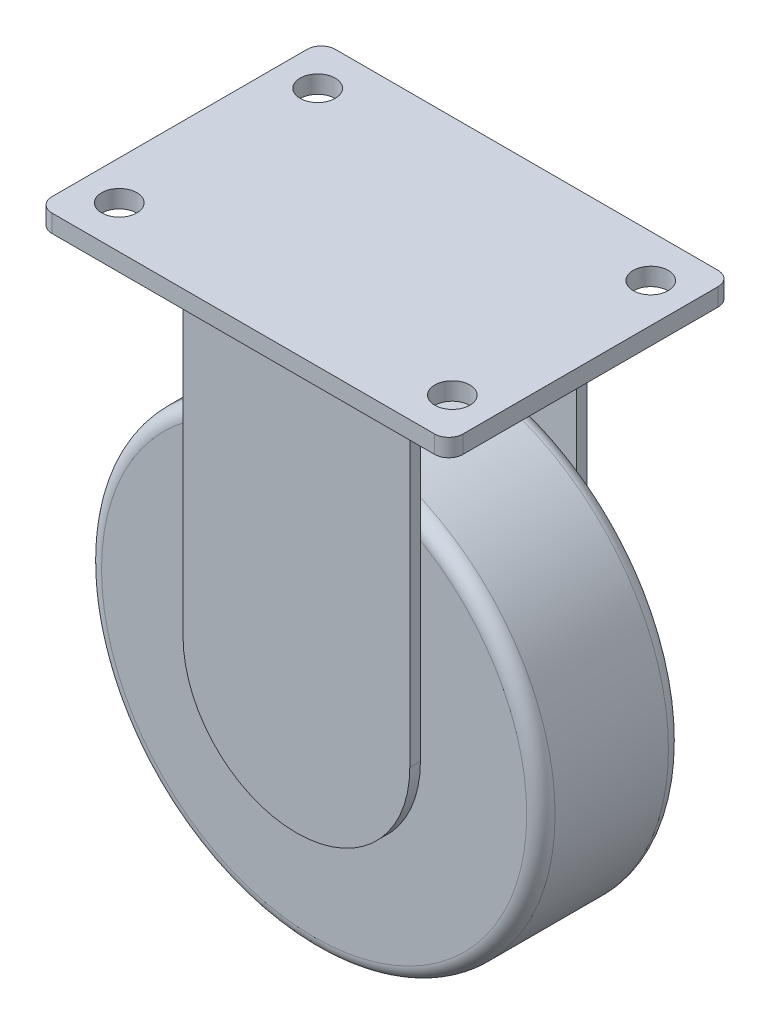
ISO-10303-21;
HEADER;
FILE_DESCRIPTION(('STEP AP214'),'2;1');
FILE_NAME('part.step','',(''),(''),'','','');
FILE_SCHEMA(('AUTOMOTIVE_DESIGN { 1 0 10303 214 1 1 1 1 }'));
ENDSEC;
DATA;
#1=APPLICATION_CONTEXT('core data for automotive mechanical design processes');
#2=APPLICATION_PROTOCOL_DEFINITION('international standard','automotive_design',2000,#1);
#3=PRODUCT_CONTEXT('',#1,'mechanical');
#4=PRODUCT('Part','Part','',(#3));
#5=PRODUCT_RELATED_PRODUCT_CATEGORY('part','',(#4));
#6=PRODUCT_DEFINITION_FORMATION('','',#4);
#7=PRODUCT_DEFINITION_CONTEXT('part definition',#1,'design');
#8=PRODUCT_DEFINITION('design','',#6,#7);
#9=PRODUCT_DEFINITION_SHAPE('','',#8);
#10=(LENGTH_UNIT() NAMED_UNIT(*) SI_UNIT(.MILLI.,.METRE.));
#11=(NAMED_UNIT(*) PLANE_ANGLE_UNIT() SI_UNIT($,.RADIAN.));
#12=(NAMED_UNIT(*) SI_UNIT($,.STERADIAN.) SOLID_ANGLE_UNIT());
#13=UNCERTAINTY_MEASURE_WITH_UNIT(LENGTH_MEASURE(1.E-05),#10,'distance_accuracy_value','');
#14=(GEOMETRIC_REPRESENTATION_CONTEXT(3) GLOBAL_UNCERTAINTY_ASSIGNED_CONTEXT((#13)) GLOBAL_UNIT_ASSIGNED_CONTEXT((#10,
#11,#12)) REPRESENTATION_CONTEXT('',''));
#15=CARTESIAN_POINT('',(0.,0.,0.));
#16=DIRECTION('',(0.,0.,1.));
#17=DIRECTION('',(1.,0.,0.));
#18=AXIS2_PLACEMENT_3D('',#15,#16,#17);
#19=CARTESIAN_POINT('',(0.,-75.40625,-500000.));
#20=DIRECTION('',(0.,0.,1.));
#21=DIRECTION('',(1.,0.,0.));
#22=AXIS2_PLACEMENT_3D('',#19,#20,#21);
#23=CYLINDRICAL_SURFACE('',#22,6.35);
#24=CARTESIAN_POINT('',(0.,-75.40625,-17.4625000000219));
#25=DIRECTION('',(0.,0.,1.));
#26=DIRECTION('',(1.,0.,0.));
#27=AXIS2_PLACEMENT_3D('',#24,#25,#26);
#28=CIRCLE('',#27,6.35);
#29=CARTESIAN_POINT('',(6.35,-75.40625,-17.4625000000788));
#30=VERTEX_POINT('',#29);
#31=EDGE_CURVE('E303',#30,#30,#28,.T.);
#32=CARTESIAN_POINT('',(0.,-75.40625,-15.8749999999941));
#33=DIRECTION('',(0.,0.,1.));
#34=DIRECTION('',(1.,0.,0.));
#35=AXIS2_PLACEMENT_3D('',#32,#33,#34);
#36=CIRCLE('',#35,6.35);
#37=CARTESIAN_POINT('',(6.35,-75.40625,-15.8750000000509));
#38=VERTEX_POINT('',#37);
#39=EDGE_CURVE('E310',#38,#38,#36,.F.);
#40=CARTESIAN_POINT('',(6.35,-75.40625,-17.4625000000788));
#41=CARTESIAN_POINT('',(6.35,-75.40625,-17.4459635417368));
#42=CARTESIAN_POINT('',(6.35,-75.40625,-17.4294270833949));
#43=CARTESIAN_POINT('',(6.35,-75.40625,-17.3963541667301));
#44=CARTESIAN_POINT('',(6.35,-75.40625,-17.3798177084071));
#45=CARTESIAN_POINT('',(6.35,-75.40625,-17.3467447917422));
#46=CARTESIAN_POINT('',(6.35,-75.40625,-17.3302083334003));
#47=CARTESIAN_POINT('',(6.35,-75.40625,-17.2971354167354));
#48=CARTESIAN_POINT('',(6.35,-75.40625,-17.2805989584125));
#49=CARTESIAN_POINT('',(6.35,-75.40625,-17.2475260417476));
#50=CARTESIAN_POINT('',(6.35,-75.40625,-17.2309895834057));
#51=CARTESIAN_POINT('',(6.35,-75.40625,-17.1979166667408));
#52=CARTESIAN_POINT('',(6.35,-75.40625,-17.1813802084178));
#53=CARTESIAN_POINT('',(6.35,-75.40625,-17.1483072917529));
#54=CARTESIAN_POINT('',(6.35,-75.40625,-17.131770833411));
#55=CARTESIAN_POINT('',(6.35,-75.40625,-17.0986979167462));
#56=CARTESIAN_POINT('',(6.35,-75.40625,-17.0821614584232));
#57=CARTESIAN_POINT('',(6.35,-75.40625,-17.0490885417583));
#58=CARTESIAN_POINT('',(6.35,-75.40625,-17.0325520834164));
#59=CARTESIAN_POINT('',(6.35,-75.40625,-16.9994791667326));
#60=CARTESIAN_POINT('',(6.35,-75.40625,-16.9829427083907));
#61=CARTESIAN_POINT('',(6.35,-75.40625,-16.9498697917258));
#62=CARTESIAN_POINT('',(6.35,-75.40625,-16.9333333334028));
#63=CARTESIAN_POINT('',(6.35,-75.40625,-16.9002604167379));
#64=CARTESIAN_POINT('',(6.35,-75.40625,-16.883723958396));
#65=CARTESIAN_POINT('',(6.35,-75.40625,-16.8506510417312));
#66=CARTESIAN_POINT('',(6.35,-75.40625,-16.8341145834082));
#67=CARTESIAN_POINT('',(6.35,-75.40625,-16.8010416667433));
#68=CARTESIAN_POINT('',(6.35,-75.40625,-16.7845052084014));
#69=CARTESIAN_POINT('',(6.35,-75.40625,-16.7514322917365));
#70=CARTESIAN_POINT('',(6.35,-75.40625,-16.7348958334135));
#71=CARTESIAN_POINT('',(6.35,-75.40625,-16.7018229167487));
#72=CARTESIAN_POINT('',(6.35,-75.40625,-16.6852864584068));
#73=CARTESIAN_POINT('',(6.35,-75.40625,-16.6522135417229));
#74=CARTESIAN_POINT('',(6.35,-75.40625,-16.635677083381));
#75=CARTESIAN_POINT('',(6.35,-75.40625,-16.6026041667161));
#76=CARTESIAN_POINT('',(6.35,-75.40625,-16.5860677083932));
#77=CARTESIAN_POINT('',(6.35,-75.40625,-16.5529947917283));
#78=CARTESIAN_POINT('',(6.35,-75.40625,-16.5364583333864));
#79=CARTESIAN_POINT('',(6.35,-75.40625,-16.5033854167215));
#80=CARTESIAN_POINT('',(6.35,-75.40625,-16.4868489583985));
#81=CARTESIAN_POINT('',(6.35,-75.40625,-16.4537760417337));
#82=CARTESIAN_POINT('',(6.35,-75.40625,-16.4372395833918));
#83=CARTESIAN_POINT('',(6.35,-75.40625,-16.4041666667269));
#84=CARTESIAN_POINT('',(6.35,-75.40625,-16.3876302084039));
#85=CARTESIAN_POINT('',(6.35,-75.40625,-16.354557291739));
#86=CARTESIAN_POINT('',(6.35,-75.40625,-16.3380208333971));
#87=CARTESIAN_POINT('',(6.35,-75.40625,-16.3049479167133));
#88=CARTESIAN_POINT('',(6.35,-75.40625,-16.2884114583714));
#89=CARTESIAN_POINT('',(6.35,-75.40625,-16.2553385417065));
#90=CARTESIAN_POINT('',(6.35,-75.40625,-16.2388020833835));
#91=CARTESIAN_POINT('',(6.35,-75.40625,-16.2057291667187));
#92=CARTESIAN_POINT('',(6.35,-75.40625,-16.1891927083767));
#93=CARTESIAN_POINT('',(6.35,-75.40625,-16.1561197917119));
#94=CARTESIAN_POINT('',(6.35,-75.40625,-16.1395833333889));
#95=CARTESIAN_POINT('',(6.35,-75.40625,-16.106510416724));
#96=CARTESIAN_POINT('',(6.35,-75.40625,-16.0899739583821));
#97=CARTESIAN_POINT('',(6.35,-75.40625,-16.0569010417172));
#98=CARTESIAN_POINT('',(6.35,-75.40625,-16.0403645833943));
#99=CARTESIAN_POINT('',(6.35,-75.40625,-16.0072916667294));
#100=CARTESIAN_POINT('',(6.35,-75.40625,-15.9907552083875));
#101=CARTESIAN_POINT('',(6.35,-75.40625,-15.9576822917226));
#102=CARTESIAN_POINT('',(6.35,-75.40625,-15.9411458333996));
#103=CARTESIAN_POINT('',(6.35,-75.40625,-15.9080729167348));
#104=CARTESIAN_POINT('',(6.35,-75.40625,-15.8915364583928));
#105=CARTESIAN_POINT('',(6.35,-75.40625,-15.8750000000509));
#106=B_SPLINE_CURVE_WITH_KNOTS('',3,(#40,#41,#42,#43,#44,#45,#46,#47,#48,#49,#50,#51,#52,#53,
#54,#55,#56,#57,#58,#59,#60,#61,#62,#63,#64,#65,#66,#67,#68,#69,#70,#71,#72,#73,#74,#75,#76,#77,
#78,#79,#80,#81,#82,#83,#84,#85,#86,#87,#88,#89,#90,#91,#92,#93,#94,#95,#96,#97,#98,#99,#100,
#101,#102,#103,#104,#105),.UNSPECIFIED.,.F.,.F.,(4,2,2,2,2,2,2,2,2,2,2,2,2,2,2,2,2,2,2,2,2,2,2,
2,2,2,2,2,2,2,2,2,4),(0.,0.0496093750257387,0.099218749994634,0.148828125020373,
0.198437499989268,0.248046875015007,0.297656249983902,0.347265625009641,0.396874999978536,
0.446484375004275,0.496093750030013,0.545703124998909,0.595312500024647,0.644921874993543,
0.694531250019281,0.744140624988177,0.793750000013915,0.843359375039654,0.892968750008549,
0.942578125034288,0.992187500003183,1.04179687502892,1.09140624999782,1.14101562502356,
1.19062500004929,1.24023437501819,1.28984375004393,1.33945312501282,1.38906250003856,
1.43867187500746,1.4882812500332,1.53789062500209,1.58750000002783),.UNSPECIFIED.);
#107=EDGE_CURVE('BSEAM48',#30,#38,#106,.T.);
#108=ORIENTED_EDGE('',*,*,#31,.T.);
#109=ORIENTED_EDGE('',*,*,#39,.T.);
#110=ORIENTED_EDGE('',*,*,#107,.T.);
#111=ORIENTED_EDGE('',*,*,#107,.F.);
#112=EDGE_LOOP('',(#108,#110,#109,#111));
#113=FACE_BOUND('',#112,.T.);
#114=ADVANCED_FACE('F48',(#113),#23,.T.);
#115=CARTESIAN_POINT('',(-46.0375,3.96875,31.75));
#116=DIRECTION('',(0.,1.,0.));
#117=DIRECTION('',(0.,0.,1.));
#118=AXIS2_PLACEMENT_3D('',#115,#116,#117);
#119=PLANE('',#118);
#120=CARTESIAN_POINT('',(37.30625,3.96875,22.225));
#121=DIRECTION('',(0.,1.,0.));
#122=DIRECTION('',(0.,0.,1.));
#123=AXIS2_PLACEMENT_3D('',#120,#121,#122);
#124=CIRCLE('',#123,3.937);
#125=CARTESIAN_POINT('',(37.30625,3.96875,26.162));
#126=VERTEX_POINT('',#125);
#127=EDGE_CURVE('E243',#126,#126,#124,.T.);
#128=ORIENTED_EDGE('',*,*,#127,.F.);
#129=EDGE_LOOP('',(#128));
#130=FACE_BOUND('',#129,.T.);
#131=CARTESIAN_POINT('',(-37.30625,3.96875,-22.225));
#132=DIRECTION('',(0.,1.,0.));
#133=DIRECTION('',(0.,0.,1.));
#134=AXIS2_PLACEMENT_3D('',#131,#132,#133);
#135=CIRCLE('',#134,3.937);
#136=CARTESIAN_POINT('',(-37.30625,3.96875,-18.288));
#137=VERTEX_POINT('',#136);
#138=EDGE_CURVE('E255',#137,#137,#135,.T.);
#139=ORIENTED_EDGE('',*,*,#138,.F.);
#140=EDGE_LOOP('',(#139));
#141=FACE_BOUND('',#140,.T.);
#142=DIRECTION('',(-1.,0.,0.));
#143=VECTOR('',#142,1.);
#144=CARTESIAN_POINT('',(-46.0375,3.96875,-31.75));
#145=LINE('',#144,#143);
#146=CARTESIAN_POINT('',(42.8625,3.96875,-31.75));
#147=VERTEX_POINT('',#146);
#148=CARTESIAN_POINT('',(-42.8625,3.96875,-31.75));
#149=VERTEX_POINT('',#148);
#150=EDGE_CURVE('E276',#147,#149,#145,.T.);
#151=ORIENTED_EDGE('',*,*,#150,.T.);
#152=CARTESIAN_POINT('',(-42.8625,3.96875,-28.575));
#153=DIRECTION('',(0.,1.,0.));
#154=DIRECTION('',(0.,0.,1.));
#155=AXIS2_PLACEMENT_3D('',#152,#153,#154);
#156=CIRCLE('',#155,3.175);
#157=CARTESIAN_POINT('',(-46.0375,3.96875,-28.575));
#158=VERTEX_POINT('',#157);
#159=EDGE_CURVE('E350',#149,#158,#156,.T.);
#160=ORIENTED_EDGE('',*,*,#159,.T.);
#161=DIRECTION('',(0.,0.,1.));
#162=VECTOR('',#161,1.);
#163=CARTESIAN_POINT('',(-46.0375,3.96875,-31.75));
#164=LINE('',#163,#162);
#165=CARTESIAN_POINT('',(-46.0375,3.96875,28.575));
#166=VERTEX_POINT('',#165);
#167=EDGE_CURVE('E269',#158,#166,#164,.T.);
#168=ORIENTED_EDGE('',*,*,#167,.T.);
#169=CARTESIAN_POINT('',(-42.8625,3.96875,28.575));
#170=DIRECTION('',(0.,1.,0.));
#171=DIRECTION('',(0.,0.,1.));
#172=AXIS2_PLACEMENT_3D('',#169,#170,#171);
#173=CIRCLE('',#172,3.175);
#174=CARTESIAN_POINT('',(-42.8625,3.96875,31.75));
#175=VERTEX_POINT('',#174);
#176=EDGE_CURVE('E345',#166,#175,#173,.T.);
#177=ORIENTED_EDGE('',*,*,#176,.T.);
#178=DIRECTION('',(1.,0.,0.));
#179=VECTOR('',#178,1.);
#180=CARTESIAN_POINT('',(-46.0375,3.96875,31.75));
#181=LINE('',#180,#179);
#182=CARTESIAN_POINT('',(42.8625,3.96875,31.75));
#183=VERTEX_POINT('',#182);
#184=EDGE_CURVE('E272',#175,#183,#181,.T.);
#185=ORIENTED_EDGE('',*,*,#184,.T.);
#186=CARTESIAN_POINT('',(42.8625,3.96875,28.575));
#187=DIRECTION('',(0.,1.,0.));
#188=DIRECTION('',(0.,0.,1.));
#189=AXIS2_PLACEMENT_3D('',#186,#187,#188);
#190=CIRCLE('',#189,3.175);
#191=CARTESIAN_POINT('',(46.0375,3.96875,28.575));
#192=VERTEX_POINT('',#191);
#193=EDGE_CURVE('E70',#183,#192,#190,.T.);
#194=ORIENTED_EDGE('',*,*,#193,.T.);
#195=DIRECTION('',(0.,0.,-1.));
#196=VECTOR('',#195,1.);
#197=CARTESIAN_POINT('',(46.0375,3.96875,-31.75));
#198=LINE('',#197,#196);
#199=CARTESIAN_POINT('',(46.0375,3.96875,-28.575));
#200=VERTEX_POINT('',#199);
#201=EDGE_CURVE('E274',#192,#200,#198,.T.);
#202=ORIENTED_EDGE('',*,*,#201,.T.);
#203=CARTESIAN_POINT('',(42.8625,3.96875,-28.575));
#204=DIRECTION('',(0.,1.,0.));
#205=DIRECTION('',(0.,0.,1.));
#206=AXIS2_PLACEMENT_3D('',#203,#204,#205);
#207=CIRCLE('',#206,3.175);
#208=EDGE_CURVE('E348',#200,#147,#207,.T.);
#209=ORIENTED_EDGE('',*,*,#208,.T.);
#210=EDGE_LOOP('',(#151,#160,#168,#177,#185,#194,#202,#209));
#211=FACE_BOUND('',#210,.T.);
#212=CARTESIAN_POINT('',(-37.30625,3.96875,22.225));
#213=DIRECTION('',(0.,1.,0.));
#214=DIRECTION('',(0.,0.,1.));
#215=AXIS2_PLACEMENT_3D('',#212,#213,#214);
#216=CIRCLE('',#215,3.937);
#217=CARTESIAN_POINT('',(-37.30625,3.96875,26.162));
#218=VERTEX_POINT('',#217);
#219=EDGE_CURVE('E249',#218,#218,#216,.T.);
#220=ORIENTED_EDGE('',*,*,#219,.F.);
#221=EDGE_LOOP('',(#220));
#222=FACE_BOUND('',#221,.T.);
#223=CARTESIAN_POINT('',(37.30625,3.96875,-22.225));
#224=DIRECTION('',(0.,1.,0.));
#225=DIRECTION('',(0.,0.,1.));
#226=AXIS2_PLACEMENT_3D('',#223,#224,#225);
#227=CIRCLE('',#226,3.937);
#228=CARTESIAN_POINT('',(37.30625,3.96875,-18.288));
#229=VERTEX_POINT('',#228);
#230=EDGE_CURVE('E237',#229,#229,#227,.T.);
#231=ORIENTED_EDGE('',*,*,#230,.F.);
#232=EDGE_LOOP('',(#231));
#233=FACE_BOUND('',#232,.T.);
#234=ADVANCED_FACE('F373',(#130,#141,#211,#222,#233),#119,.T.);
#235=CARTESIAN_POINT('',(-46.0375,0.,31.75));
#236=DIRECTION('',(0.,1.,0.));
#237=DIRECTION('',(0.,0.,1.));
#238=AXIS2_PLACEMENT_3D('',#235,#236,#237);
#239=PLANE('',#238);
#240=DIRECTION('',(-1.,0.,0.));
#241=VECTOR('',#240,1.);
#242=CARTESIAN_POINT('',(-25.4,0.,-19.84375));
#243=LINE('',#242,#241);
#244=CARTESIAN_POINT('',(25.4,0.,-19.84375));
#245=VERTEX_POINT('',#244);
#246=CARTESIAN_POINT('',(-25.4,0.,-19.84375));
#247=VERTEX_POINT('',#246);
#248=EDGE_CURVE('E186',#245,#247,#243,.T.);
#249=ORIENTED_EDGE('',*,*,#248,.T.);
#250=DIRECTION('',(0.,0.,1.));
#251=VECTOR('',#250,1.);
#252=CARTESIAN_POINT('',(-25.4,0.,-17.4625));
#253=LINE('',#252,#251);
#254=CARTESIAN_POINT('',(-25.4,0.,-17.4625));
#255=VERTEX_POINT('',#254);
#256=EDGE_CURVE('E180',#247,#255,#253,.T.);
#257=ORIENTED_EDGE('',*,*,#256,.T.);
#258=DIRECTION('',(1.,0.,0.));
#259=VECTOR('',#258,1.);
#260=CARTESIAN_POINT('',(-25.4,0.,-17.4625));
#261=LINE('',#260,#259);
#262=CARTESIAN_POINT('',(25.4,0.,-17.4625));
#263=VERTEX_POINT('',#262);
#264=EDGE_CURVE('E189',#255,#263,#261,.T.);
#265=ORIENTED_EDGE('',*,*,#264,.T.);
#266=DIRECTION('',(0.,0.,-1.));
#267=VECTOR('',#266,1.);
#268=CARTESIAN_POINT('',(25.4,0.,-17.4625));
#269=LINE('',#268,#267);
#270=EDGE_CURVE('E195',#263,#245,#269,.T.);
#271=ORIENTED_EDGE('',*,*,#270,.T.);
#272=EDGE_LOOP('',(#249,#257,#265,#271));
#273=FACE_BOUND('',#272,.T.);
#274=DIRECTION('',(-1.,0.,0.));
#275=VECTOR('',#274,1.);
#276=CARTESIAN_POINT('',(-25.4,0.,17.4625));
#277=LINE('',#276,#275);
#278=CARTESIAN_POINT('',(25.4,0.,17.4625));
#279=VERTEX_POINT('',#278);
#280=CARTESIAN_POINT('',(-25.4,0.,17.4625));
#281=VERTEX_POINT('',#280);
#282=EDGE_CURVE('E223',#279,#281,#277,.T.);
#283=ORIENTED_EDGE('',*,*,#282,.T.);
#284=DIRECTION('',(0.,0.,1.));
#285=VECTOR('',#284,1.);
#286=CARTESIAN_POINT('',(-25.4,0.,19.84375));
#287=LINE('',#286,#285);
#288=CARTESIAN_POINT('',(-25.4,0.,19.84375));
#289=VERTEX_POINT('',#288);
#290=EDGE_CURVE('E211',#281,#289,#287,.T.);
#291=ORIENTED_EDGE('',*,*,#290,.T.);
#292=DIRECTION('',(1.,0.,0.));
#293=VECTOR('',#292,1.);
#294=CARTESIAN_POINT('',(-25.4,0.,19.84375));
#295=LINE('',#294,#293);
#296=CARTESIAN_POINT('',(25.4,0.,19.84375));
#297=VERTEX_POINT('',#296);
#298=EDGE_CURVE('E217',#289,#297,#295,.T.);
#299=ORIENTED_EDGE('',*,*,#298,.T.);
#300=DIRECTION('',(0.,0.,-1.));
#301=VECTOR('',#300,1.);
#302=CARTESIAN_POINT('',(25.4,0.,19.84375));
#303=LINE('',#302,#301);
#304=EDGE_CURVE('E220',#297,#279,#303,.T.);
#305=ORIENTED_EDGE('',*,*,#304,.T.);
#306=EDGE_LOOP('',(#283,#291,#299,#305));
#307=FACE_BOUND('',#306,.T.);
#308=CARTESIAN_POINT('',(37.30625,0.,22.225));
#309=DIRECTION('',(0.,1.,0.));
#310=DIRECTION('',(0.,0.,1.));
#311=AXIS2_PLACEMENT_3D('',#308,#309,#310);
#312=CIRCLE('',#311,3.937);
#313=CARTESIAN_POINT('',(37.30625,0.,26.162));
#314=VERTEX_POINT('',#313);
#315=EDGE_CURVE('E240',#314,#314,#312,.T.);
#316=ORIENTED_EDGE('',*,*,#315,.T.);
#317=EDGE_LOOP('',(#316));
#318=FACE_BOUND('',#317,.T.);
#319=CARTESIAN_POINT('',(-37.30625,0.,-22.225));
#320=DIRECTION('',(0.,1.,0.));
#321=DIRECTION('',(0.,0.,1.));
#322=AXIS2_PLACEMENT_3D('',#319,#320,#321);
#323=CIRCLE('',#322,3.937);
#324=CARTESIAN_POINT('',(-37.30625,0.,-18.288));
#325=VERTEX_POINT('',#324);
#326=EDGE_CURVE('E252',#325,#325,#323,.T.);
#327=ORIENTED_EDGE('',*,*,#326,.T.);
#328=EDGE_LOOP('',(#327));
#329=FACE_BOUND('',#328,.T.);
#330=DIRECTION('',(0.,0.,1.));
#331=VECTOR('',#330,1.);
#332=CARTESIAN_POINT('',(-46.0375,0.,-31.75));
#333=LINE('',#332,#331);
#334=CARTESIAN_POINT('',(-46.0375,0.,-28.575));
#335=VERTEX_POINT('',#334);
#336=CARTESIAN_POINT('',(-46.0375,0.,28.575));
#337=VERTEX_POINT('',#336);
#338=EDGE_CURVE('E258',#335,#337,#333,.T.);
#339=ORIENTED_EDGE('',*,*,#338,.F.);
#340=CARTESIAN_POINT('',(-42.8625,0.,-28.575));
#341=DIRECTION('',(0.,1.,0.));
#342=DIRECTION('',(0.,0.,1.));
#343=AXIS2_PLACEMENT_3D('',#340,#341,#342);
#344=CIRCLE('',#343,3.175);
#345=CARTESIAN_POINT('',(-42.8625,0.,-31.75));
#346=VERTEX_POINT('',#345);
#347=EDGE_CURVE('E338',#335,#346,#344,.F.);
#348=ORIENTED_EDGE('',*,*,#347,.T.);
#349=DIRECTION('',(-1.,0.,0.));
#350=VECTOR('',#349,1.);
#351=CARTESIAN_POINT('',(-46.0375,0.,-31.75));
#352=LINE('',#351,#350);
#353=CARTESIAN_POINT('',(42.8625,0.,-31.75));
#354=VERTEX_POINT('',#353);
#355=EDGE_CURVE('E266',#354,#346,#352,.T.);
#356=ORIENTED_EDGE('',*,*,#355,.F.);
#357=CARTESIAN_POINT('',(42.8625,0.,-28.575));
#358=DIRECTION('',(0.,1.,0.));
#359=DIRECTION('',(0.,0.,1.));
#360=AXIS2_PLACEMENT_3D('',#357,#358,#359);
#361=CIRCLE('',#360,3.175);
#362=CARTESIAN_POINT('',(46.0375,0.,-28.575));
#363=VERTEX_POINT('',#362);
#364=EDGE_CURVE('E336',#354,#363,#361,.F.);
#365=ORIENTED_EDGE('',*,*,#364,.T.);
#366=DIRECTION('',(0.,0.,-1.));
#367=VECTOR('',#366,1.);
#368=CARTESIAN_POINT('',(46.0375,0.,-31.75));
#369=LINE('',#368,#367);
#370=CARTESIAN_POINT('',(46.0375,0.,28.575));
#371=VERTEX_POINT('',#370);
#372=EDGE_CURVE('E264',#371,#363,#369,.T.);
#373=ORIENTED_EDGE('',*,*,#372,.F.);
#374=CARTESIAN_POINT('',(42.8625,0.,28.575));
#375=DIRECTION('',(0.,1.,0.));
#376=DIRECTION('',(0.,0.,1.));
#377=AXIS2_PLACEMENT_3D('',#374,#375,#376);
#378=CIRCLE('',#377,3.175);
#379=CARTESIAN_POINT('',(42.8625,0.,31.75));
#380=VERTEX_POINT('',#379);
#381=EDGE_CURVE('E334',#371,#380,#378,.F.);
#382=ORIENTED_EDGE('',*,*,#381,.T.);
#383=DIRECTION('',(1.,0.,0.));
#384=VECTOR('',#383,1.);
#385=CARTESIAN_POINT('',(-46.0375,0.,31.75));
#386=LINE('',#385,#384);
#387=CARTESIAN_POINT('',(-42.8625,0.,31.75));
#388=VERTEX_POINT('',#387);
#389=EDGE_CURVE('E261',#388,#380,#386,.T.);
#390=ORIENTED_EDGE('',*,*,#389,.F.);
#391=CARTESIAN_POINT('',(-42.8625,0.,28.575));
#392=DIRECTION('',(0.,1.,0.));
#393=DIRECTION('',(0.,0.,1.));
#394=AXIS2_PLACEMENT_3D('',#391,#392,#393);
#395=CIRCLE('',#394,3.175);
#396=EDGE_CURVE('E332',#388,#337,#395,.F.);
#397=ORIENTED_EDGE('',*,*,#396,.T.);
#398=EDGE_LOOP('',(#339,#348,#356,#365,#373,#382,#390,#397));
#399=FACE_BOUND('',#398,.T.);
#400=CARTESIAN_POINT('',(-37.30625,0.,22.225));
#401=DIRECTION('',(0.,1.,0.));
#402=DIRECTION('',(0.,0.,1.));
#403=AXIS2_PLACEMENT_3D('',#400,#401,#402);
#404=CIRCLE('',#403,3.937);
#405=CARTESIAN_POINT('',(-37.30625,0.,26.162));
#406=VERTEX_POINT('',#405);
#407=EDGE_CURVE('E246',#406,#406,#404,.T.);
#408=ORIENTED_EDGE('',*,*,#407,.T.);
#409=EDGE_LOOP('',(#408));
#410=FACE_BOUND('',#409,.T.);
#411=CARTESIAN_POINT('',(37.30625,0.,-22.225));
#412=DIRECTION('',(0.,1.,0.));
#413=DIRECTION('',(0.,0.,1.));
#414=AXIS2_PLACEMENT_3D('',#411,#412,#413);
#415=CIRCLE('',#414,3.937);
#416=CARTESIAN_POINT('',(37.30625,0.,-18.288));
#417=VERTEX_POINT('',#416);
#418=EDGE_CURVE('E229',#417,#417,#415,.T.);
#419=ORIENTED_EDGE('',*,*,#418,.T.);
#420=EDGE_LOOP('',(#419));
#421=FACE_BOUND('',#420,.T.);
#422=ADVANCED_FACE('F197',(#273,#307,#318,#329,#399,#410,#421),#239,.F.);
#423=CARTESIAN_POINT('',(-46.0375,3.96875,-31.75));
#424=DIRECTION('',(1.,0.,0.));
#425=DIRECTION('',(0.,0.,-1.));
#426=AXIS2_PLACEMENT_3D('',#423,#424,#425);
#427=PLANE('',#426);
#428=ORIENTED_EDGE('',*,*,#167,.F.);
#429=DIRECTION('',(0.,-1.,0.));
#430=VECTOR('',#429,1.);
#431=CARTESIAN_POINT('',(-46.0375,3.96875,-28.575));
#432=LINE('',#431,#430);
#433=EDGE_CURVE('E329',#158,#335,#432,.T.);
#434=ORIENTED_EDGE('',*,*,#433,.T.);
#435=ORIENTED_EDGE('',*,*,#338,.T.);
#436=DIRECTION('',(0.,-1.,0.));
#437=VECTOR('',#436,1.);
#438=CARTESIAN_POINT('',(-46.0375,3.96875,28.575));
#439=LINE('',#438,#437);
#440=EDGE_CURVE('E327',#337,#166,#439,.F.);
#441=ORIENTED_EDGE('',*,*,#440,.T.);
#442=EDGE_LOOP('',(#428,#434,#435,#441));
#443=FACE_BOUND('',#442,.T.);
#444=ADVANCED_FACE('F50',(#443),#427,.F.);
#445=CARTESIAN_POINT('',(-46.0375,3.96875,31.75));
#446=DIRECTION('',(0.,0.,-1.));
#447=DIRECTION('',(-1.,0.,0.));
#448=AXIS2_PLACEMENT_3D('',#445,#446,#447);
#449=PLANE('',#448);
#450=ORIENTED_EDGE('',*,*,#389,.T.);
#451=DIRECTION('',(0.,-1.,0.));
#452=VECTOR('',#451,1.);
#453=CARTESIAN_POINT('',(42.8625,3.96875,31.75));
#454=LINE('',#453,#452);
#455=EDGE_CURVE('E13',#380,#183,#454,.F.);
#456=ORIENTED_EDGE('',*,*,#455,.T.);
#457=ORIENTED_EDGE('',*,*,#184,.F.);
#458=DIRECTION('',(0.,-1.,0.));
#459=VECTOR('',#458,1.);
#460=CARTESIAN_POINT('',(-42.8625,3.96875,31.75));
#461=LINE('',#460,#459);
#462=EDGE_CURVE('E56',#175,#388,#461,.T.);
#463=ORIENTED_EDGE('',*,*,#462,.T.);
#464=EDGE_LOOP('',(#450,#456,#457,#463));
#465=FACE_BOUND('',#464,.T.);
#466=ADVANCED_FACE('F360',(#465),#449,.F.);
#467=CARTESIAN_POINT('',(46.0375,3.96875,-31.75));
#468=DIRECTION('',(-1.,0.,0.));
#469=DIRECTION('',(0.,0.,1.));
#470=AXIS2_PLACEMENT_3D('',#467,#468,#469);
#471=PLANE('',#470);
#472=ORIENTED_EDGE('',*,*,#372,.T.);
#473=DIRECTION('',(0.,-1.,0.));
#474=VECTOR('',#473,1.);
#475=CARTESIAN_POINT('',(46.0375,3.96875,-28.575));
#476=LINE('',#475,#474);
#477=EDGE_CURVE('E63',#363,#200,#476,.F.);
#478=ORIENTED_EDGE('',*,*,#477,.T.);
#479=ORIENTED_EDGE('',*,*,#201,.F.);
#480=DIRECTION('',(0.,-1.,0.));
#481=VECTOR('',#480,1.);
#482=CARTESIAN_POINT('',(46.0375,3.96875,28.575));
#483=LINE('',#482,#481);
#484=EDGE_CURVE('E352',#192,#371,#483,.T.);
#485=ORIENTED_EDGE('',*,*,#484,.T.);
#486=EDGE_LOOP('',(#472,#478,#479,#485));
#487=FACE_BOUND('',#486,.T.);
#488=ADVANCED_FACE('F371',(#487),#471,.F.);
#489=CARTESIAN_POINT('',(-46.0375,3.96875,-31.75));
#490=DIRECTION('',(0.,0.,1.));
#491=DIRECTION('',(1.,0.,0.));
#492=AXIS2_PLACEMENT_3D('',#489,#490,#491);
#493=PLANE('',#492);
#494=ORIENTED_EDGE('',*,*,#355,.T.);
#495=DIRECTION('',(0.,-1.,0.));
#496=VECTOR('',#495,1.);
#497=CARTESIAN_POINT('',(-42.8625,3.96875,-31.75));
#498=LINE('',#497,#496);
#499=EDGE_CURVE('E343',#346,#149,#498,.F.);
#500=ORIENTED_EDGE('',*,*,#499,.T.);
#501=ORIENTED_EDGE('',*,*,#150,.F.);
#502=DIRECTION('',(0.,-1.,0.));
#503=VECTOR('',#502,1.);
#504=CARTESIAN_POINT('',(42.8625,3.96875,-31.75));
#505=LINE('',#504,#503);
#506=EDGE_CURVE('E340',#147,#354,#505,.T.);
#507=ORIENTED_EDGE('',*,*,#506,.T.);
#508=EDGE_LOOP('',(#494,#500,#501,#507));
#509=FACE_BOUND('',#508,.T.);
#510=ADVANCED_FACE('F381',(#509),#493,.F.);
#511=CARTESIAN_POINT('',(-37.30625,3.96875,-22.225));
#512=DIRECTION('',(0.,-1.,0.));
#513=DIRECTION('',(0.,0.,-1.));
#514=AXIS2_PLACEMENT_3D('',#511,#512,#513);
#515=CYLINDRICAL_SURFACE('',#514,3.937);
#516=ORIENTED_EDGE('',*,*,#138,.T.);
#517=EDGE_LOOP('',(#516));
#518=FACE_BOUND('',#517,.T.);
#519=ORIENTED_EDGE('',*,*,#326,.F.);
#520=EDGE_LOOP('',(#519));
#521=FACE_BOUND('',#520,.T.);
#522=ADVANCED_FACE('F475',(#518,#521),#515,.F.);
#523=CARTESIAN_POINT('',(-37.30625,3.96875,22.225));
#524=DIRECTION('',(0.,-1.,0.));
#525=DIRECTION('',(0.,0.,-1.));
#526=AXIS2_PLACEMENT_3D('',#523,#524,#525);
#527=CYLINDRICAL_SURFACE('',#526,3.937);
#528=ORIENTED_EDGE('',*,*,#219,.T.);
#529=EDGE_LOOP('',(#528));
#530=FACE_BOUND('',#529,.T.);
#531=ORIENTED_EDGE('',*,*,#407,.F.);
#532=EDGE_LOOP('',(#531));
#533=FACE_BOUND('',#532,.T.);
#534=ADVANCED_FACE('F471',(#530,#533),#527,.F.);
#535=CARTESIAN_POINT('',(37.30625,3.96875,22.225));
#536=DIRECTION('',(0.,-1.,0.));
#537=DIRECTION('',(0.,0.,-1.));
#538=AXIS2_PLACEMENT_3D('',#535,#536,#537);
#539=CYLINDRICAL_SURFACE('',#538,3.937);
#540=ORIENTED_EDGE('',*,*,#127,.T.);
#541=EDGE_LOOP('',(#540));
#542=FACE_BOUND('',#541,.T.);
#543=ORIENTED_EDGE('',*,*,#315,.F.);
#544=EDGE_LOOP('',(#543));
#545=FACE_BOUND('',#544,.T.);
#546=ADVANCED_FACE('F467',(#542,#545),#539,.F.);
#547=CARTESIAN_POINT('',(37.30625,3.96875,-22.225));
#548=DIRECTION('',(0.,-1.,0.));
#549=DIRECTION('',(0.,0.,-1.));
#550=AXIS2_PLACEMENT_3D('',#547,#548,#549);
#551=CYLINDRICAL_SURFACE('',#550,3.937);
#552=ORIENTED_EDGE('',*,*,#230,.T.);
#553=EDGE_LOOP('',(#552));
#554=FACE_BOUND('',#553,.T.);
#555=ORIENTED_EDGE('',*,*,#418,.F.);
#556=EDGE_LOOP('',(#555));
#557=FACE_BOUND('',#556,.T.);
#558=ADVANCED_FACE('F464',(#554,#557),#551,.F.);
#559=CARTESIAN_POINT('',(-25.4,-100.80625,19.84375));
#560=DIRECTION('',(-1.,0.,0.));
#561=DIRECTION('',(0.,0.,1.));
#562=AXIS2_PLACEMENT_3D('',#559,#560,#561);
#563=PLANE('',#562);
#564=DIRECTION('',(0.,1.,0.));
#565=VECTOR('',#564,1.);
#566=CARTESIAN_POINT('',(-25.4,-100.80625,17.4625));
#567=LINE('',#566,#565);
#568=CARTESIAN_POINT('',(-25.4,-75.40625,17.4625));
#569=VERTEX_POINT('',#568);
#570=EDGE_CURVE('E227',#569,#281,#567,.T.);
#571=ORIENTED_EDGE('',*,*,#570,.F.);
#572=DIRECTION('',(0.,0.,1.));
#573=VECTOR('',#572,1.);
#574=CARTESIAN_POINT('',(-25.4,-75.40625,19.84375));
#575=LINE('',#574,#573);
#576=CARTESIAN_POINT('',(-25.4,-75.40625,19.84375));
#577=VERTEX_POINT('',#576);
#578=EDGE_CURVE('E279',#569,#577,#575,.T.);
#579=ORIENTED_EDGE('',*,*,#578,.T.);
#580=DIRECTION('',(0.,1.,0.));
#581=VECTOR('',#580,1.);
#582=CARTESIAN_POINT('',(-25.4,-100.80625,19.84375));
#583=LINE('',#582,#581);
#584=EDGE_CURVE('E226',#577,#289,#583,.T.);
#585=ORIENTED_EDGE('',*,*,#584,.T.);
#586=ORIENTED_EDGE('',*,*,#290,.F.);
#587=EDGE_LOOP('',(#571,#579,#585,#586));
#588=FACE_BOUND('',#587,.T.);
#589=ADVANCED_FACE('F429',(#588),#563,.T.);
#590=CARTESIAN_POINT('',(-25.4,-100.80625,17.4625));
#591=DIRECTION('',(0.,0.,-1.));
#592=DIRECTION('',(-1.,0.,0.));
#593=AXIS2_PLACEMENT_3D('',#590,#591,#592);
#594=PLANE('',#593);
#595=CARTESIAN_POINT('',(0.,-75.40625,17.4625000000219));
#596=DIRECTION('',(0.,0.,-1.));
#597=DIRECTION('',(-1.,0.,0.));
#598=AXIS2_PLACEMENT_3D('',#595,#596,#597);
#599=CIRCLE('',#598,6.35);
#600=CARTESIAN_POINT('',(6.35,-75.40625,17.4625000000788));
#601=VERTEX_POINT('',#600);
#602=EDGE_CURVE('E306',#601,#601,#599,.T.);
#603=ORIENTED_EDGE('',*,*,#602,.F.);
#604=EDGE_LOOP('',(#603));
#605=FACE_BOUND('',#604,.T.);
#606=CARTESIAN_POINT('',(0.,-75.40625,17.4625));
#607=DIRECTION('',(0.,0.,-1.));
#608=DIRECTION('',(-1.,0.,0.));
#609=AXIS2_PLACEMENT_3D('',#606,#607,#608);
#610=CIRCLE('',#609,25.4);
#611=CARTESIAN_POINT('',(25.4,-75.40625,17.4625));
#612=VERTEX_POINT('',#611);
#613=CARTESIAN_POINT('',(0.,-100.80625,17.4625));
#614=VERTEX_POINT('',#613);
#615=EDGE_CURVE('E286',#612,#614,#610,.T.);
#616=ORIENTED_EDGE('',*,*,#615,.T.);
#617=CARTESIAN_POINT('',(0.,-75.40625,17.4625));
#618=DIRECTION('',(0.,0.,-1.));
#619=DIRECTION('',(-1.,0.,0.));
#620=AXIS2_PLACEMENT_3D('',#617,#618,#619);
#621=CIRCLE('',#620,25.4);
#622=EDGE_CURVE('E288',#614,#569,#621,.T.);
#623=ORIENTED_EDGE('',*,*,#622,.T.);
#624=ORIENTED_EDGE('',*,*,#570,.T.);
#625=ORIENTED_EDGE('',*,*,#282,.F.);
#626=DIRECTION('',(0.,1.,0.));
#627=VECTOR('',#626,1.);
#628=CARTESIAN_POINT('',(25.4,-100.80625,17.4625));
#629=LINE('',#628,#627);
#630=EDGE_CURVE('E230',#612,#279,#629,.T.);
#631=ORIENTED_EDGE('',*,*,#630,.F.);
#632=EDGE_LOOP('',(#616,#623,#624,#625,#631));
#633=FACE_BOUND('',#632,.T.);
#634=ADVANCED_FACE('F425',(#605,#633),#594,.T.);
#635=CARTESIAN_POINT('',(25.4,-100.80625,19.84375));
#636=DIRECTION('',(1.,0.,0.));
#637=DIRECTION('',(0.,0.,-1.));
#638=AXIS2_PLACEMENT_3D('',#635,#636,#637);
#639=PLANE('',#638);
#640=DIRECTION('',(0.,1.,0.));
#641=VECTOR('',#640,1.);
#642=CARTESIAN_POINT('',(25.4,-100.80625,19.84375));
#643=LINE('',#642,#641);
#644=CARTESIAN_POINT('',(25.4,-75.40625,19.84375));
#645=VERTEX_POINT('',#644);
#646=EDGE_CURVE('E232',#645,#297,#643,.T.);
#647=ORIENTED_EDGE('',*,*,#646,.F.);
#648=DIRECTION('',(0.,0.,-1.));
#649=VECTOR('',#648,1.);
#650=CARTESIAN_POINT('',(25.4,-75.40625,19.84375));
#651=LINE('',#650,#649);
#652=EDGE_CURVE('E301',#645,#612,#651,.T.);
#653=ORIENTED_EDGE('',*,*,#652,.T.);
#654=ORIENTED_EDGE('',*,*,#630,.T.);
#655=ORIENTED_EDGE('',*,*,#304,.F.);
#656=EDGE_LOOP('',(#647,#653,#654,#655));
#657=FACE_BOUND('',#656,.T.);
#658=ADVANCED_FACE('F428',(#657),#639,.T.);
#659=CARTESIAN_POINT('',(-25.4,-100.80625,19.84375));
#660=DIRECTION('',(0.,0.,1.));
#661=DIRECTION('',(1.,0.,0.));
#662=AXIS2_PLACEMENT_3D('',#659,#660,#661);
#663=PLANE('',#662);
#664=ORIENTED_EDGE('',*,*,#584,.F.);
#665=CARTESIAN_POINT('',(0.,-75.40625,19.84375));
#666=DIRECTION('',(0.,0.,1.));
#667=DIRECTION('',(1.,0.,0.));
#668=AXIS2_PLACEMENT_3D('',#665,#666,#667);
#669=CIRCLE('',#668,25.4);
#670=CARTESIAN_POINT('',(0.,-100.80625,19.84375));
#671=VERTEX_POINT('',#670);
#672=EDGE_CURVE('E284',#577,#671,#669,.T.);
#673=ORIENTED_EDGE('',*,*,#672,.T.);
#674=CARTESIAN_POINT('',(0.,-75.40625,19.84375));
#675=DIRECTION('',(0.,0.,1.));
#676=DIRECTION('',(1.,0.,0.));
#677=AXIS2_PLACEMENT_3D('',#674,#675,#676);
#678=CIRCLE('',#677,25.4);
#679=EDGE_CURVE('E282',#671,#645,#678,.T.);
#680=ORIENTED_EDGE('',*,*,#679,.T.);
#681=ORIENTED_EDGE('',*,*,#646,.T.);
#682=ORIENTED_EDGE('',*,*,#298,.F.);
#683=EDGE_LOOP('',(#664,#673,#680,#681,#682));
#684=FACE_BOUND('',#683,.T.);
#685=ADVANCED_FACE('F449',(#684),#663,.T.);
#686=CARTESIAN_POINT('',(-25.4,-100.80625,-17.4625));
#687=DIRECTION('',(-1.,0.,0.));
#688=DIRECTION('',(0.,0.,1.));
#689=AXIS2_PLACEMENT_3D('',#686,#687,#688);
#690=PLANE('',#689);
#691=DIRECTION('',(0.,1.,0.));
#692=VECTOR('',#691,1.);
#693=CARTESIAN_POINT('',(-25.4,-100.80625,-19.84375));
#694=LINE('',#693,#692);
#695=CARTESIAN_POINT('',(-25.4,-75.40625,-19.84375));
#696=VERTEX_POINT('',#695);
#697=EDGE_CURVE('E209',#696,#247,#694,.T.);
#698=ORIENTED_EDGE('',*,*,#697,.F.);
#699=DIRECTION('',(0.,0.,1.));
#700=VECTOR('',#699,1.);
#701=CARTESIAN_POINT('',(-25.4,-75.40625,-17.4625));
#702=LINE('',#701,#700);
#703=CARTESIAN_POINT('',(-25.4,-75.40625,-17.4625));
#704=VERTEX_POINT('',#703);
#705=EDGE_CURVE('E183',#696,#704,#702,.T.);
#706=ORIENTED_EDGE('',*,*,#705,.T.);
#707=DIRECTION('',(0.,1.,0.));
#708=VECTOR('',#707,1.);
#709=CARTESIAN_POINT('',(-25.4,-100.80625,-17.4625));
#710=LINE('',#709,#708);
#711=EDGE_CURVE('E175',#704,#255,#710,.T.);
#712=ORIENTED_EDGE('',*,*,#711,.T.);
#713=ORIENTED_EDGE('',*,*,#256,.F.);
#714=EDGE_LOOP('',(#698,#706,#712,#713));
#715=FACE_BOUND('',#714,.T.);
#716=ADVANCED_FACE('F178',(#715),#690,.T.);
#717=CARTESIAN_POINT('',(-25.4,-100.80625,-19.84375));
#718=DIRECTION('',(0.,0.,-1.));
#719=DIRECTION('',(-1.,0.,0.));
#720=AXIS2_PLACEMENT_3D('',#717,#718,#719);
#721=PLANE('',#720);
#722=CARTESIAN_POINT('',(0.,-75.40625,-19.84375));
#723=DIRECTION('',(0.,0.,-1.));
#724=DIRECTION('',(-1.,0.,0.));
#725=AXIS2_PLACEMENT_3D('',#722,#723,#724);
#726=CIRCLE('',#725,25.4);
#727=CARTESIAN_POINT('',(25.4,-75.40625,-19.84375));
#728=VERTEX_POINT('',#727);
#729=CARTESIAN_POINT('',(0.,-100.80625,-19.84375));
#730=VERTEX_POINT('',#729);
#731=EDGE_CURVE('E295',#728,#730,#726,.T.);
#732=ORIENTED_EDGE('',*,*,#731,.T.);
#733=CARTESIAN_POINT('',(0.,-75.40625,-19.84375));
#734=DIRECTION('',(0.,0.,-1.));
#735=DIRECTION('',(-1.,0.,0.));
#736=AXIS2_PLACEMENT_3D('',#733,#734,#735);
#737=CIRCLE('',#736,25.4);
#738=EDGE_CURVE('E297',#730,#696,#737,.T.);
#739=ORIENTED_EDGE('',*,*,#738,.T.);
#740=ORIENTED_EDGE('',*,*,#697,.T.);
#741=ORIENTED_EDGE('',*,*,#248,.F.);
#742=DIRECTION('',(0.,1.,0.));
#743=VECTOR('',#742,1.);
#744=CARTESIAN_POINT('',(25.4,-100.80625,-19.84375));
#745=LINE('',#744,#743);
#746=EDGE_CURVE('E212',#728,#245,#745,.T.);
#747=ORIENTED_EDGE('',*,*,#746,.F.);
#748=EDGE_LOOP('',(#732,#739,#740,#741,#747));
#749=FACE_BOUND('',#748,.T.);
#750=ADVANCED_FACE('F612',(#749),#721,.T.);
#751=CARTESIAN_POINT('',(25.4,-100.80625,-17.4625));
#752=DIRECTION('',(1.,0.,0.));
#753=DIRECTION('',(0.,0.,-1.));
#754=AXIS2_PLACEMENT_3D('',#751,#752,#753);
#755=PLANE('',#754);
#756=DIRECTION('',(0.,1.,0.));
#757=VECTOR('',#756,1.);
#758=CARTESIAN_POINT('',(25.4,-100.80625,-17.4625));
#759=LINE('',#758,#757);
#760=CARTESIAN_POINT('',(25.4,-75.40625,-17.4625));
#761=VERTEX_POINT('',#760);
#762=EDGE_CURVE('E185',#761,#263,#759,.T.);
#763=ORIENTED_EDGE('',*,*,#762,.F.);
#764=DIRECTION('',(0.,0.,-1.));
#765=VECTOR('',#764,1.);
#766=CARTESIAN_POINT('',(25.4,-75.40625,-17.4625));
#767=LINE('',#766,#765);
#768=EDGE_CURVE('E299',#761,#728,#767,.T.);
#769=ORIENTED_EDGE('',*,*,#768,.T.);
#770=ORIENTED_EDGE('',*,*,#746,.T.);
#771=ORIENTED_EDGE('',*,*,#270,.F.);
#772=EDGE_LOOP('',(#763,#769,#770,#771));
#773=FACE_BOUND('',#772,.T.);
#774=ADVANCED_FACE('F564',(#773),#755,.T.);
#775=CARTESIAN_POINT('',(-25.4,-100.80625,-17.4625));
#776=DIRECTION('',(0.,0.,1.));
#777=DIRECTION('',(1.,0.,0.));
#778=AXIS2_PLACEMENT_3D('',#775,#776,#777);
#779=PLANE('',#778);
#780=ORIENTED_EDGE('',*,*,#31,.F.);
#781=EDGE_LOOP('',(#780));
#782=FACE_BOUND('',#781,.T.);
#783=ORIENTED_EDGE('',*,*,#711,.F.);
#784=CARTESIAN_POINT('',(0.,-75.40625,-17.4625));
#785=DIRECTION('',(0.,0.,1.));
#786=DIRECTION('',(1.,0.,0.));
#787=AXIS2_PLACEMENT_3D('',#784,#785,#786);
#788=CIRCLE('',#787,25.4);
#789=CARTESIAN_POINT('',(0.,-100.80625,-17.4625));
#790=VERTEX_POINT('',#789);
#791=EDGE_CURVE('E293',#704,#790,#788,.T.);
#792=ORIENTED_EDGE('',*,*,#791,.T.);
#793=CARTESIAN_POINT('',(0.,-75.40625,-17.4625));
#794=DIRECTION('',(0.,0.,1.));
#795=DIRECTION('',(1.,0.,0.));
#796=AXIS2_PLACEMENT_3D('',#793,#794,#795);
#797=CIRCLE('',#796,25.4);
#798=EDGE_CURVE('E291',#790,#761,#797,.T.);
#799=ORIENTED_EDGE('',*,*,#798,.T.);
#800=ORIENTED_EDGE('',*,*,#762,.T.);
#801=ORIENTED_EDGE('',*,*,#264,.F.);
#802=EDGE_LOOP('',(#783,#792,#799,#800,#801));
#803=FACE_BOUND('',#802,.T.);
#804=ADVANCED_FACE('F190',(#782,#803),#779,.T.);
#805=CARTESIAN_POINT('',(0.,-75.40625,19.8437499999999));
#806=DIRECTION('',(0.,0.,-1.));
#807=DIRECTION('',(-1.,0.,0.));
#808=AXIS2_PLACEMENT_3D('',#805,#806,#807);
#809=CYLINDRICAL_SURFACE('',#808,25.4);
#810=DIRECTION('',(0.,0.,-1.));
#811=VECTOR('',#810,1.);
#812=CARTESIAN_POINT('',(0.,-100.80625,17.4625000000001));
#813=LINE('',#812,#811);
#814=EDGE_CURVE('E200',#614,#671,#813,.F.);
#815=ORIENTED_EDGE('',*,*,#814,.F.);
#816=ORIENTED_EDGE('',*,*,#615,.F.);
#817=ORIENTED_EDGE('',*,*,#652,.F.);
#818=ORIENTED_EDGE('',*,*,#679,.F.);
#819=EDGE_LOOP('',(#815,#816,#817,#818));
#820=FACE_BOUND('',#819,.T.);
#821=ADVANCED_FACE('F440',(#820),#809,.T.);
#822=CARTESIAN_POINT('',(0.,-75.40625,19.84375));
#823=DIRECTION('',(0.,0.,1.));
#824=DIRECTION('',(1.,0.,0.));
#825=AXIS2_PLACEMENT_3D('',#822,#823,#824);
#826=CYLINDRICAL_SURFACE('',#825,25.4);
#827=ORIENTED_EDGE('',*,*,#622,.F.);
#828=ORIENTED_EDGE('',*,*,#814,.T.);
#829=ORIENTED_EDGE('',*,*,#672,.F.);
#830=ORIENTED_EDGE('',*,*,#578,.F.);
#831=EDGE_LOOP('',(#827,#828,#829,#830));
#832=FACE_BOUND('',#831,.T.);
#833=ADVANCED_FACE('F443',(#832),#826,.T.);
#834=CARTESIAN_POINT('',(0.,-75.40625,-17.4624999999999));
#835=DIRECTION('',(0.,0.,-1.));
#836=DIRECTION('',(-1.,0.,0.));
#837=AXIS2_PLACEMENT_3D('',#834,#835,#836);
#838=CYLINDRICAL_SURFACE('',#837,25.4);
#839=DIRECTION('',(0.,0.,-1.));
#840=VECTOR('',#839,1.);
#841=CARTESIAN_POINT('',(0.,-100.80625,-19.8437500000001));
#842=LINE('',#841,#840);
#843=EDGE_CURVE('E203',#730,#790,#842,.F.);
#844=ORIENTED_EDGE('',*,*,#843,.F.);
#845=ORIENTED_EDGE('',*,*,#731,.F.);
#846=ORIENTED_EDGE('',*,*,#768,.F.);
#847=ORIENTED_EDGE('',*,*,#798,.F.);
#848=EDGE_LOOP('',(#844,#845,#846,#847));
#849=FACE_BOUND('',#848,.T.);
#850=ADVANCED_FACE('F419',(#849),#838,.T.);
#851=CARTESIAN_POINT('',(0.,-75.40625,-17.4625));
#852=DIRECTION('',(0.,0.,1.));
#853=DIRECTION('',(1.,0.,0.));
#854=AXIS2_PLACEMENT_3D('',#851,#852,#853);
#855=CYLINDRICAL_SURFACE('',#854,25.4);
#856=ORIENTED_EDGE('',*,*,#738,.F.);
#857=ORIENTED_EDGE('',*,*,#843,.T.);
#858=ORIENTED_EDGE('',*,*,#791,.F.);
#859=ORIENTED_EDGE('',*,*,#705,.F.);
#860=EDGE_LOOP('',(#856,#857,#858,#859));
#861=FACE_BOUND('',#860,.T.);
#862=ADVANCED_FACE('F411',(#861),#855,.T.);
#863=CARTESIAN_POINT('',(0.,-75.40625,15.8749999999941));
#864=DIRECTION('',(0.,0.,1.));
#865=DIRECTION('',(1.,0.,0.));
#866=AXIS2_PLACEMENT_3D('',#863,#864,#865);
#867=CIRCLE('',#866,6.35);
#868=CARTESIAN_POINT('',(6.35,-75.40625,15.8749999999372));
#869=VERTEX_POINT('',#868);
#870=EDGE_CURVE('E309',#869,#869,#867,.F.);
#871=CARTESIAN_POINT('',(6.35,-75.40625,15.8749999999372));
#872=CARTESIAN_POINT('',(6.35,-75.40625,15.8915364582792));
#873=CARTESIAN_POINT('',(6.35,-75.40625,15.9080729166211));
#874=CARTESIAN_POINT('',(6.35,-75.40625,15.9411458332859));
#875=CARTESIAN_POINT('',(6.35,-75.40625,15.9576822916089));
#876=CARTESIAN_POINT('',(6.35,-75.40625,15.9907552082738));
#877=CARTESIAN_POINT('',(6.35,-75.40625,16.0072916666157));
#878=CARTESIAN_POINT('',(6.35,-75.40625,16.0403645832806));
#879=CARTESIAN_POINT('',(6.35,-75.40625,16.0569010416035));
#880=CARTESIAN_POINT('',(6.35,-75.40625,16.0899739582684));
#881=CARTESIAN_POINT('',(6.35,-75.40625,16.1065104166103));
#882=CARTESIAN_POINT('',(6.35,-75.40625,16.1395833332942));
#883=CARTESIAN_POINT('',(6.35,-75.40625,16.1561197916361));
#884=CARTESIAN_POINT('',(6.35,-75.40625,16.189192708301));
#885=CARTESIAN_POINT('',(6.35,-75.40625,16.2057291666239));
#886=CARTESIAN_POINT('',(6.35,-75.40625,16.2388020832888));
#887=CARTESIAN_POINT('',(6.35,-75.40625,16.2553385416307));
#888=CARTESIAN_POINT('',(6.35,-75.40625,16.2884114583145));
#889=CARTESIAN_POINT('',(6.35,-75.40625,16.3049479166564));
#890=CARTESIAN_POINT('',(6.35,-75.40625,16.3380208333213));
#891=CARTESIAN_POINT('',(6.35,-75.40625,16.3545572916443));
#892=CARTESIAN_POINT('',(6.35,-75.40625,16.3876302083092));
#893=CARTESIAN_POINT('',(6.35,-75.40625,16.4041666666511));
#894=CARTESIAN_POINT('',(6.35,-75.40625,16.4372395833349));
#895=CARTESIAN_POINT('',(6.35,-75.40625,16.4537760416768));
#896=CARTESIAN_POINT('',(6.35,-75.40625,16.4868489583417));
#897=CARTESIAN_POINT('',(6.35,-75.40625,16.5033854166647));
#898=CARTESIAN_POINT('',(6.35,-75.40625,16.5364583333295));
#899=CARTESIAN_POINT('',(6.35,-75.40625,16.5529947916715));
#900=CARTESIAN_POINT('',(6.35,-75.40625,16.5860677083363));
#901=CARTESIAN_POINT('',(6.35,-75.40625,16.6026041666593));
#902=CARTESIAN_POINT('',(6.35,-75.40625,16.6356770833242));
#903=CARTESIAN_POINT('',(6.35,-75.40625,16.6522135416661));
#904=CARTESIAN_POINT('',(6.35,-75.40625,16.6852864583499));
#905=CARTESIAN_POINT('',(6.35,-75.40625,16.7018229166918));
#906=CARTESIAN_POINT('',(6.35,-75.40625,16.7348958333567));
#907=CARTESIAN_POINT('',(6.35,-75.40625,16.7514322916797));
#908=CARTESIAN_POINT('',(6.35,-75.40625,16.7845052083446));
#909=CARTESIAN_POINT('',(6.35,-75.40625,16.8010416666865));
#910=CARTESIAN_POINT('',(6.35,-75.40625,16.8341145833513));
#911=CARTESIAN_POINT('',(6.35,-75.40625,16.8506510416743));
#912=CARTESIAN_POINT('',(6.35,-75.40625,16.8837239583392));
#913=CARTESIAN_POINT('',(6.35,-75.40625,16.9002604166811));
#914=CARTESIAN_POINT('',(6.35,-75.40625,16.9333333333649));
#915=CARTESIAN_POINT('',(6.35,-75.40625,16.9498697917068));
#916=CARTESIAN_POINT('',(6.35,-75.40625,16.9829427083717));
#917=CARTESIAN_POINT('',(6.35,-75.40625,16.9994791666947));
#918=CARTESIAN_POINT('',(6.35,-75.40625,17.0325520833596));
#919=CARTESIAN_POINT('',(6.35,-75.40625,17.0490885417015));
#920=CARTESIAN_POINT('',(6.35,-75.40625,17.0821614583853));
#921=CARTESIAN_POINT('',(6.35,-75.40625,17.0986979167272));
#922=CARTESIAN_POINT('',(6.35,-75.40625,17.1317708333921));
#923=CARTESIAN_POINT('',(6.35,-75.40625,17.1483072917151));
#924=CARTESIAN_POINT('',(6.35,-75.40625,17.1813802083799));
#925=CARTESIAN_POINT('',(6.35,-75.40625,17.1979166667218));
#926=CARTESIAN_POINT('',(6.35,-75.40625,17.2309895834057));
#927=CARTESIAN_POINT('',(6.35,-75.40625,17.2475260417476));
#928=CARTESIAN_POINT('',(6.35,-75.40625,17.2805989584125));
#929=CARTESIAN_POINT('',(6.35,-75.40625,17.2971354167354));
#930=CARTESIAN_POINT('',(6.35,-75.40625,17.3302083334003));
#931=CARTESIAN_POINT('',(6.35,-75.40625,17.3467447917422));
#932=CARTESIAN_POINT('',(6.35,-75.40625,17.3798177084071));
#933=CARTESIAN_POINT('',(6.35,-75.40625,17.3963541667301));
#934=CARTESIAN_POINT('',(6.35,-75.40625,17.4294270833949));
#935=CARTESIAN_POINT('',(6.35,-75.40625,17.4459635417368));
#936=CARTESIAN_POINT('',(6.35,-75.40625,17.4625000000788));
#937=B_SPLINE_CURVE_WITH_KNOTS('',3,(#871,#872,#873,#874,#875,#876,#877,#878,#879,#880,#881,
#882,#883,#884,#885,#886,#887,#888,#889,#890,#891,#892,#893,#894,#895,#896,#897,#898,#899,#900,
#901,#902,#903,#904,#905,#906,#907,#908,#909,#910,#911,#912,#913,#914,#915,#916,#917,#918,#919,
#920,#921,#922,#923,#924,#925,#926,#927,#928,#929,#930,#931,#932,#933,#934,#935,#936),
.UNSPECIFIED.,.F.,.F.,(4,2,2,2,2,2,2,2,2,2,2,2,2,2,2,2,2,2,2,2,2,2,2,2,2,2,2,2,2,2,2,2,4),(0.,
0.0496093750257387,0.099218749994634,0.148828125020373,0.198437499989268,0.248046875015007,
0.297656250040745,0.347265625009641,0.396875000035379,0.446484375061118,0.496093750030013,
0.545703125055752,0.595312500081491,0.644921875050386,0.694531250076125,0.74414062504502,
0.793750000070759,0.843359375096497,0.892968750065393,0.942578125091131,0.992187500060027,
1.04179687508577,1.0914062501115,1.1410156250804,1.19062500010614,1.24023437513188,
1.28984375010077,1.33945312512651,1.38906250015225,1.43867187512114,1.48828125014688,
1.53789062511578,1.58750000014152),.UNSPECIFIED.);
#938=EDGE_CURVE('BSEAM400',#869,#601,#937,.T.);
#939=ORIENTED_EDGE('',*,*,#870,.F.);
#940=ORIENTED_EDGE('',*,*,#602,.T.);
#941=ORIENTED_EDGE('',*,*,#938,.T.);
#942=ORIENTED_EDGE('',*,*,#938,.F.);
#943=EDGE_LOOP('',(#939,#941,#940,#942));
#944=FACE_BOUND('',#943,.T.);
#945=ADVANCED_FACE('F400',(#944),#23,.T.);
#946=CARTESIAN_POINT('',(0.,-75.40625,15.875));
#947=DIRECTION('',(0.,0.,-1.));
#948=DIRECTION('',(-1.,0.,0.));
#949=AXIS2_PLACEMENT_3D('',#946,#947,#948);
#950=CYLINDRICAL_SURFACE('',#949,50.8);
#951=CARTESIAN_POINT('',(0.,-75.40625,-12.7));
#952=DIRECTION('',(0.,0.,1.));
#953=DIRECTION('',(1.,0.,0.));
#954=AXIS2_PLACEMENT_3D('',#951,#952,#953);
#955=CIRCLE('',#954,50.8);
#956=CARTESIAN_POINT('',(50.8,-75.40625,-12.7));
#957=VERTEX_POINT('',#956);
#958=EDGE_CURVE('E318',#957,#957,#955,.T.);
#959=ORIENTED_EDGE('',*,*,#958,.T.);
#960=EDGE_LOOP('',(#959));
#961=FACE_BOUND('',#960,.T.);
#962=CARTESIAN_POINT('',(0.,-75.40625,12.7));
#963=DIRECTION('',(0.,0.,1.));
#964=DIRECTION('',(1.,0.,0.));
#965=AXIS2_PLACEMENT_3D('',#962,#963,#964);
#966=CIRCLE('',#965,50.8);
#967=CARTESIAN_POINT('',(50.8,-75.40625,12.7));
#968=VERTEX_POINT('',#967);
#969=EDGE_CURVE('E315',#968,#968,#966,.F.);
#970=ORIENTED_EDGE('',*,*,#969,.T.);
#971=EDGE_LOOP('',(#970));
#972=FACE_BOUND('',#971,.T.);
#973=ADVANCED_FACE('F410',(#961,#972),#950,.T.);
#974=CARTESIAN_POINT('',(0.,-75.40625,15.875));
#975=DIRECTION('',(0.,0.,1.));
#976=DIRECTION('',(1.,0.,0.));
#977=AXIS2_PLACEMENT_3D('',#974,#975,#976);
#978=PLANE('',#977);
#979=CARTESIAN_POINT('',(0.,-75.40625,15.875));
#980=DIRECTION('',(0.,0.,1.));
#981=DIRECTION('',(1.,0.,0.));
#982=AXIS2_PLACEMENT_3D('',#979,#980,#981);
#983=CIRCLE('',#982,47.625);
#984=CARTESIAN_POINT('',(47.625,-75.40625,15.875));
#985=VERTEX_POINT('',#984);
#986=EDGE_CURVE('E324',#985,#985,#983,.T.);
#987=ORIENTED_EDGE('',*,*,#986,.T.);
#988=EDGE_LOOP('',(#987));
#989=FACE_BOUND('',#988,.T.);
#990=ORIENTED_EDGE('',*,*,#870,.T.);
#991=EDGE_LOOP('',(#990));
#992=FACE_BOUND('',#991,.T.);
#993=ADVANCED_FACE('F417',(#989,#992),#978,.T.);
#994=CARTESIAN_POINT('',(0.,-75.40625,-15.875));
#995=DIRECTION('',(0.,0.,1.));
#996=DIRECTION('',(1.,0.,0.));
#997=AXIS2_PLACEMENT_3D('',#994,#995,#996);
#998=PLANE('',#997);
#999=CARTESIAN_POINT('',(0.,-75.40625,-15.875));
#1000=DIRECTION('',(0.,0.,1.));
#1001=DIRECTION('',(1.,0.,0.));
#1002=AXIS2_PLACEMENT_3D('',#999,#1000,#1001);
#1003=CIRCLE('',#1002,47.625);
#1004=CARTESIAN_POINT('',(47.625,-75.40625,-15.875));
#1005=VERTEX_POINT('',#1004);
#1006=EDGE_CURVE('E321',#1005,#1005,#1003,.F.);
#1007=ORIENTED_EDGE('',*,*,#1006,.T.);
#1008=EDGE_LOOP('',(#1007));
#1009=FACE_BOUND('',#1008,.T.);
#1010=ORIENTED_EDGE('',*,*,#39,.F.);
#1011=EDGE_LOOP('',(#1010));
#1012=FACE_BOUND('',#1011,.T.);
#1013=ADVANCED_FACE('F521',(#1009,#1012),#998,.F.);
#1014=CARTESIAN_POINT('',(0.,-75.40625,-12.7));
#1015=DIRECTION('',(0.,0.,1.));
#1016=DIRECTION('',(1.,0.,0.));
#1017=AXIS2_PLACEMENT_3D('',#1014,#1015,#1016);
#1018=TOROIDAL_SURFACE('',#1017,47.625,3.175);
#1019=ORIENTED_EDGE('',*,*,#1006,.F.);
#1020=EDGE_LOOP('',(#1019));
#1021=FACE_BOUND('',#1020,.T.);
#1022=ORIENTED_EDGE('',*,*,#958,.F.);
#1023=EDGE_LOOP('',(#1022));
#1024=FACE_BOUND('',#1023,.T.);
#1025=ADVANCED_FACE('F509',(#1021,#1024),#1018,.T.);
#1026=CARTESIAN_POINT('',(0.,-75.40625,12.7));
#1027=DIRECTION('',(0.,0.,1.));
#1028=DIRECTION('',(1.,0.,0.));
#1029=AXIS2_PLACEMENT_3D('',#1026,#1027,#1028);
#1030=TOROIDAL_SURFACE('',#1029,47.625,3.175);
#1031=ORIENTED_EDGE('',*,*,#969,.F.);
#1032=EDGE_LOOP('',(#1031));
#1033=FACE_BOUND('',#1032,.T.);
#1034=ORIENTED_EDGE('',*,*,#986,.F.);
#1035=EDGE_LOOP('',(#1034));
#1036=FACE_BOUND('',#1035,.T.);
#1037=ADVANCED_FACE('F504',(#1033,#1036),#1030,.T.);
#1038=CARTESIAN_POINT('',(-42.8625,3.96875,-28.575));
#1039=DIRECTION('',(0.,-1.,0.));
#1040=DIRECTION('',(0.,0.,-1.));
#1041=AXIS2_PLACEMENT_3D('',#1038,#1039,#1040);
#1042=CYLINDRICAL_SURFACE('',#1041,3.175);
#1043=ORIENTED_EDGE('',*,*,#159,.F.);
#1044=ORIENTED_EDGE('',*,*,#499,.F.);
#1045=ORIENTED_EDGE('',*,*,#347,.F.);
#1046=ORIENTED_EDGE('',*,*,#433,.F.);
#1047=EDGE_LOOP('',(#1043,#1044,#1045,#1046));
#1048=FACE_BOUND('',#1047,.T.);
#1049=ADVANCED_FACE('F386',(#1048),#1042,.T.);
#1050=CARTESIAN_POINT('',(42.8625,3.96875,-28.575));
#1051=DIRECTION('',(0.,-1.,0.));
#1052=DIRECTION('',(0.,0.,-1.));
#1053=AXIS2_PLACEMENT_3D('',#1050,#1051,#1052);
#1054=CYLINDRICAL_SURFACE('',#1053,3.175);
#1055=ORIENTED_EDGE('',*,*,#208,.F.);
#1056=ORIENTED_EDGE('',*,*,#477,.F.);
#1057=ORIENTED_EDGE('',*,*,#364,.F.);
#1058=ORIENTED_EDGE('',*,*,#506,.F.);
#1059=EDGE_LOOP('',(#1055,#1056,#1057,#1058));
#1060=FACE_BOUND('',#1059,.T.);
#1061=ADVANCED_FACE('F378',(#1060),#1054,.T.);
#1062=CARTESIAN_POINT('',(42.8625,3.96875,28.575));
#1063=DIRECTION('',(0.,-1.,0.));
#1064=DIRECTION('',(0.,0.,-1.));
#1065=AXIS2_PLACEMENT_3D('',#1062,#1063,#1064);
#1066=CYLINDRICAL_SURFACE('',#1065,3.175);
#1067=ORIENTED_EDGE('',*,*,#193,.F.);
#1068=ORIENTED_EDGE('',*,*,#455,.F.);
#1069=ORIENTED_EDGE('',*,*,#381,.F.);
#1070=ORIENTED_EDGE('',*,*,#484,.F.);
#1071=EDGE_LOOP('',(#1067,#1068,#1069,#1070));
#1072=FACE_BOUND('',#1071,.T.);
#1073=ADVANCED_FACE('F370',(#1072),#1066,.T.);
#1074=CARTESIAN_POINT('',(-42.8625,3.96875,28.575));
#1075=DIRECTION('',(0.,-1.,0.));
#1076=DIRECTION('',(0.,0.,-1.));
#1077=AXIS2_PLACEMENT_3D('',#1074,#1075,#1076);
#1078=CYLINDRICAL_SURFACE('',#1077,3.175);
#1079=ORIENTED_EDGE('',*,*,#176,.F.);
#1080=ORIENTED_EDGE('',*,*,#440,.F.);
#1081=ORIENTED_EDGE('',*,*,#396,.F.);
#1082=ORIENTED_EDGE('',*,*,#462,.F.);
#1083=EDGE_LOOP('',(#1079,#1080,#1081,#1082));
#1084=FACE_BOUND('',#1083,.T.);
#1085=ADVANCED_FACE('F390',(#1084),#1078,.T.);
#1086=CLOSED_SHELL('',(#114,#234,#422,#444,#466,#488,#510,#522,#534,#546,#558,#589,#634,#658,
#685,#716,#750,#774,#804,#821,#833,#850,#862,#945,#973,#993,#1013,#1025,#1037,#1049,#1061,#1073,#1085));
#1087=MANIFOLD_SOLID_BREP('B2',#1086);
#1088=ADVANCED_BREP_SHAPE_REPRESENTATION('',(#18,#1087),#14);
#1089=SHAPE_DEFINITION_REPRESENTATION(#9,#1088);
ENDSEC;
END-ISO-10303-21;
